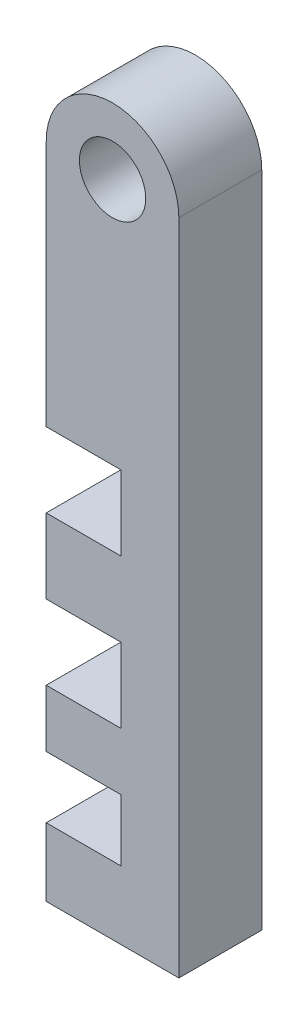
ISO-10303-21;
HEADER;
FILE_DESCRIPTION(('STEP AP214'),'2;1');
FILE_NAME('part.step','',(''),(''),'','','');
FILE_SCHEMA(('AUTOMOTIVE_DESIGN { 1 0 10303 214 1 1 1 1 }'));
ENDSEC;
DATA;
#1=APPLICATION_CONTEXT('core data for automotive mechanical design processes');
#2=APPLICATION_PROTOCOL_DEFINITION('international standard','automotive_design',2000,#1);
#3=PRODUCT_CONTEXT('',#1,'mechanical');
#4=PRODUCT('Part','Part','',(#3));
#5=PRODUCT_RELATED_PRODUCT_CATEGORY('part','',(#4));
#6=PRODUCT_DEFINITION_FORMATION('','',#4);
#7=PRODUCT_DEFINITION_CONTEXT('part definition',#1,'design');
#8=PRODUCT_DEFINITION('design','',#6,#7);
#9=PRODUCT_DEFINITION_SHAPE('','',#8);
#10=(LENGTH_UNIT() NAMED_UNIT(*) SI_UNIT(.MILLI.,.METRE.));
#11=(NAMED_UNIT(*) PLANE_ANGLE_UNIT() SI_UNIT($,.RADIAN.));
#12=(NAMED_UNIT(*) SI_UNIT($,.STERADIAN.) SOLID_ANGLE_UNIT());
#13=UNCERTAINTY_MEASURE_WITH_UNIT(LENGTH_MEASURE(1.E-05),#10,'distance_accuracy_value','');
#14=(GEOMETRIC_REPRESENTATION_CONTEXT(3) GLOBAL_UNCERTAINTY_ASSIGNED_CONTEXT((#13)) GLOBAL_UNIT_ASSIGNED_CONTEXT((#10,
#11,#12)) REPRESENTATION_CONTEXT('',''));
#15=CARTESIAN_POINT('',(0.,0.,0.));
#16=DIRECTION('',(0.,0.,1.));
#17=DIRECTION('',(1.,0.,0.));
#18=AXIS2_PLACEMENT_3D('',#15,#16,#17);
#19=CARTESIAN_POINT('',(-56.8186498005052,11.3062459124783,5.));
#20=DIRECTION('',(0.,0.,1.));
#21=DIRECTION('',(1.,0.,0.));
#22=AXIS2_PLACEMENT_3D('',#19,#20,#21);
#23=PLANE('',#22);
#24=CARTESIAN_POINT('',(-56.8186498005052,11.3062459124783,5.));
#25=DIRECTION('',(0.,0.,1.));
#26=DIRECTION('',(1.,0.,0.));
#27=AXIS2_PLACEMENT_3D('',#24,#25,#26);
#28=CIRCLE('',#27,4.00000000000001);
#29=CARTESIAN_POINT('',(-52.8186498005052,11.3062459124783,5.));
#30=VERTEX_POINT('',#29);
#31=CARTESIAN_POINT('',(-60.8186498005052,11.3062459124783,5.));
#32=VERTEX_POINT('',#31);
#33=EDGE_CURVE('E209',#30,#32,#28,.T.);
#34=ORIENTED_EDGE('',*,*,#33,.T.);
#35=DIRECTION('',(0.,-1.,0.));
#36=VECTOR('',#35,1.);
#37=CARTESIAN_POINT('',(-60.8186498005052,1.00460991247836,5.));
#38=LINE('',#37,#36);
#39=CARTESIAN_POINT('',(-60.8186498005052,-3.60922108752164,5.));
#40=VERTEX_POINT('',#39);
#41=EDGE_CURVE('E117',#32,#40,#38,.T.);
#42=ORIENTED_EDGE('',*,*,#41,.T.);
#43=DIRECTION('',(1.,0.,0.));
#44=VECTOR('',#43,1.);
#45=CARTESIAN_POINT('',(-56.3186498005052,-3.60922108752164,5.));
#46=LINE('',#45,#44);
#47=CARTESIAN_POINT('',(-56.3186498005052,-3.60922108752164,5.));
#48=VERTEX_POINT('',#47);
#49=EDGE_CURVE('E248',#40,#48,#46,.T.);
#50=ORIENTED_EDGE('',*,*,#49,.T.);
#51=DIRECTION('',(0.,-1.,0.));
#52=VECTOR('',#51,1.);
#53=CARTESIAN_POINT('',(-56.3186498005052,-8.10922108752164,5.));
#54=LINE('',#53,#52);
#55=CARTESIAN_POINT('',(-56.3186498005052,-8.10922108752164,5.));
#56=VERTEX_POINT('',#55);
#57=EDGE_CURVE('E267',#48,#56,#54,.T.);
#58=ORIENTED_EDGE('',*,*,#57,.T.);
#59=DIRECTION('',(-1.,0.,0.));
#60=VECTOR('',#59,1.);
#61=CARTESIAN_POINT('',(-60.8186498005052,-8.10922108752164,5.));
#62=LINE('',#61,#60);
#63=CARTESIAN_POINT('',(-60.8186498005052,-8.10922108752164,5.));
#64=VERTEX_POINT('',#63);
#65=EDGE_CURVE('E264',#56,#64,#62,.T.);
#66=ORIENTED_EDGE('',*,*,#65,.T.);
#67=DIRECTION('',(0.,-1.,0.));
#68=VECTOR('',#67,1.);
#69=CARTESIAN_POINT('',(-60.8186498005052,-12.6092210875216,5.));
#70=LINE('',#69,#68);
#71=CARTESIAN_POINT('',(-60.8186498005052,-12.6092210875216,5.));
#72=VERTEX_POINT('',#71);
#73=EDGE_CURVE('E266',#64,#72,#70,.T.);
#74=ORIENTED_EDGE('',*,*,#73,.T.);
#75=DIRECTION('',(1.,0.,0.));
#76=VECTOR('',#75,1.);
#77=CARTESIAN_POINT('',(-56.3186498005052,-12.6092210875216,5.));
#78=LINE('',#77,#76);
#79=CARTESIAN_POINT('',(-56.3186498005052,-12.6092210875216,5.));
#80=VERTEX_POINT('',#79);
#81=EDGE_CURVE('E269',#72,#80,#78,.T.);
#82=ORIENTED_EDGE('',*,*,#81,.T.);
#83=DIRECTION('',(0.,-1.,0.));
#84=VECTOR('',#83,1.);
#85=CARTESIAN_POINT('',(-56.3186498005052,-17.1092210875216,5.));
#86=LINE('',#85,#84);
#87=CARTESIAN_POINT('',(-56.3186498005052,-17.1092210875216,5.));
#88=VERTEX_POINT('',#87);
#89=EDGE_CURVE('E275',#80,#88,#86,.T.);
#90=ORIENTED_EDGE('',*,*,#89,.T.);
#91=DIRECTION('',(-1.,0.,0.));
#92=VECTOR('',#91,1.);
#93=CARTESIAN_POINT('',(-60.8186498005052,-17.1092210875216,5.));
#94=LINE('',#93,#92);
#95=CARTESIAN_POINT('',(-60.8186498005052,-17.1092210875216,5.));
#96=VERTEX_POINT('',#95);
#97=EDGE_CURVE('E277',#88,#96,#94,.T.);
#98=ORIENTED_EDGE('',*,*,#97,.T.);
#99=DIRECTION('',(0.,-1.,0.));
#100=VECTOR('',#99,1.);
#101=CARTESIAN_POINT('',(-60.8186498005052,-20.5733320875216,5.));
#102=LINE('',#101,#100);
#103=CARTESIAN_POINT('',(-60.8186498005052,-20.5733320875216,5.));
#104=VERTEX_POINT('',#103);
#105=EDGE_CURVE('E279',#96,#104,#102,.T.);
#106=ORIENTED_EDGE('',*,*,#105,.T.);
#107=DIRECTION('',(1.,0.,0.));
#108=VECTOR('',#107,1.);
#109=CARTESIAN_POINT('',(-56.3186498005052,-20.5733320875216,5.));
#110=LINE('',#109,#108);
#111=CARTESIAN_POINT('',(-56.3186498005052,-20.5733320875216,5.));
#112=VERTEX_POINT('',#111);
#113=EDGE_CURVE('E281',#104,#112,#110,.T.);
#114=ORIENTED_EDGE('',*,*,#113,.T.);
#115=DIRECTION('',(0.,-1.,0.));
#116=VECTOR('',#115,1.);
#117=CARTESIAN_POINT('',(-56.3186498005052,-20.5733320875216,5.));
#118=LINE('',#117,#116);
#119=CARTESIAN_POINT('',(-56.3186498005052,-24.2940960875216,5.));
#120=VERTEX_POINT('',#119);
#121=EDGE_CURVE('E283',#112,#120,#118,.T.);
#122=ORIENTED_EDGE('',*,*,#121,.T.);
#123=DIRECTION('',(-1.,0.,0.));
#124=VECTOR('',#123,1.);
#125=CARTESIAN_POINT('',(-60.8186498005052,-24.2940960875216,5.));
#126=LINE('',#125,#124);
#127=CARTESIAN_POINT('',(-60.8186498005052,-24.2940960875216,5.));
#128=VERTEX_POINT('',#127);
#129=EDGE_CURVE('E160',#120,#128,#126,.T.);
#130=ORIENTED_EDGE('',*,*,#129,.T.);
#131=DIRECTION('',(0.,-1.,0.));
#132=VECTOR('',#131,1.);
#133=CARTESIAN_POINT('',(-60.8186498005052,-28.4024330875216,5.));
#134=LINE('',#133,#132);
#135=CARTESIAN_POINT('',(-60.8186498005052,-28.4024330875216,5.));
#136=VERTEX_POINT('',#135);
#137=EDGE_CURVE('E154',#128,#136,#134,.T.);
#138=ORIENTED_EDGE('',*,*,#137,.T.);
#139=DIRECTION('',(1.,0.,0.));
#140=VECTOR('',#139,1.);
#141=CARTESIAN_POINT('',(-52.8186498005052,-28.4024330875216,5.));
#142=LINE('',#141,#140);
#143=CARTESIAN_POINT('',(-52.8186498005052,-28.4024330875216,5.));
#144=VERTEX_POINT('',#143);
#145=EDGE_CURVE('E158',#136,#144,#142,.T.);
#146=ORIENTED_EDGE('',*,*,#145,.T.);
#147=DIRECTION('',(0.,1.,0.));
#148=VECTOR('',#147,1.);
#149=CARTESIAN_POINT('',(-52.8186498005052,11.3062459124783,5.));
#150=LINE('',#149,#148);
#151=EDGE_CURVE('E50',#144,#30,#150,.T.);
#152=ORIENTED_EDGE('',*,*,#151,.T.);
#153=EDGE_LOOP('',(#34,#42,#50,#58,#66,#74,#82,#90,#98,#106,#114,#122,#130,#138,#146,#152));
#154=FACE_BOUND('',#153,.T.);
#155=CARTESIAN_POINT('',(-56.8186498005052,11.3062459124783,5.));
#156=DIRECTION('',(0.,0.,1.));
#157=DIRECTION('',(1.,0.,0.));
#158=AXIS2_PLACEMENT_3D('',#155,#156,#157);
#159=CIRCLE('',#158,2.);
#160=CARTESIAN_POINT('',(-54.8186498005052,11.3062459124783,5.));
#161=VERTEX_POINT('',#160);
#162=EDGE_CURVE('E182',#161,#161,#159,.T.);
#163=ORIENTED_EDGE('',*,*,#162,.F.);
#164=EDGE_LOOP('',(#163));
#165=FACE_BOUND('',#164,.T.);
#166=ADVANCED_FACE('F33',(#154,#165),#23,.T.);
#167=CARTESIAN_POINT('',(-56.8186498005052,11.3062459124783,0.));
#168=DIRECTION('',(0.,0.,1.));
#169=DIRECTION('',(1.,0.,0.));
#170=AXIS2_PLACEMENT_3D('',#167,#168,#169);
#171=PLANE('',#170);
#172=CARTESIAN_POINT('',(-56.8186498005052,11.3062459124783,0.));
#173=DIRECTION('',(0.,0.,1.));
#174=DIRECTION('',(1.,0.,0.));
#175=AXIS2_PLACEMENT_3D('',#172,#173,#174);
#176=CIRCLE('',#175,4.00000000000001);
#177=CARTESIAN_POINT('',(-52.8186498005052,11.3062459124783,0.));
#178=VERTEX_POINT('',#177);
#179=CARTESIAN_POINT('',(-60.8186498005052,11.3062459124783,0.));
#180=VERTEX_POINT('',#179);
#181=EDGE_CURVE('E178',#178,#180,#176,.T.);
#182=ORIENTED_EDGE('',*,*,#181,.F.);
#183=DIRECTION('',(0.,1.,0.));
#184=VECTOR('',#183,1.);
#185=CARTESIAN_POINT('',(-52.8186498005052,11.3062459124783,0.));
#186=LINE('',#185,#184);
#187=CARTESIAN_POINT('',(-52.8186498005052,-28.4024330875216,0.));
#188=VERTEX_POINT('',#187);
#189=EDGE_CURVE('E109',#188,#178,#186,.T.);
#190=ORIENTED_EDGE('',*,*,#189,.F.);
#191=DIRECTION('',(1.,0.,0.));
#192=VECTOR('',#191,1.);
#193=CARTESIAN_POINT('',(-52.8186498005052,-28.4024330875216,0.));
#194=LINE('',#193,#192);
#195=CARTESIAN_POINT('',(-60.8186498005052,-28.4024330875216,0.));
#196=VERTEX_POINT('',#195);
#197=EDGE_CURVE('E103',#196,#188,#194,.T.);
#198=ORIENTED_EDGE('',*,*,#197,.F.);
#199=DIRECTION('',(0.,-1.,0.));
#200=VECTOR('',#199,1.);
#201=CARTESIAN_POINT('',(-60.8186498005052,-28.4024330875216,0.));
#202=LINE('',#201,#200);
#203=CARTESIAN_POINT('',(-60.8186498005052,-24.2940960875216,0.));
#204=VERTEX_POINT('',#203);
#205=EDGE_CURVE('E168',#204,#196,#202,.T.);
#206=ORIENTED_EDGE('',*,*,#205,.F.);
#207=DIRECTION('',(-1.,0.,0.));
#208=VECTOR('',#207,1.);
#209=CARTESIAN_POINT('',(-60.8186498005052,-24.2940960875216,0.));
#210=LINE('',#209,#208);
#211=CARTESIAN_POINT('',(-56.3186498005052,-24.2940960875216,0.));
#212=VERTEX_POINT('',#211);
#213=EDGE_CURVE('E204',#212,#204,#210,.T.);
#214=ORIENTED_EDGE('',*,*,#213,.F.);
#215=DIRECTION('',(0.,-1.,0.));
#216=VECTOR('',#215,1.);
#217=CARTESIAN_POINT('',(-56.3186498005052,-20.5733320875216,0.));
#218=LINE('',#217,#216);
#219=CARTESIAN_POINT('',(-56.3186498005052,-20.5733320875216,0.));
#220=VERTEX_POINT('',#219);
#221=EDGE_CURVE('E202',#220,#212,#218,.T.);
#222=ORIENTED_EDGE('',*,*,#221,.F.);
#223=DIRECTION('',(1.,0.,0.));
#224=VECTOR('',#223,1.);
#225=CARTESIAN_POINT('',(-56.3186498005052,-20.5733320875216,0.));
#226=LINE('',#225,#224);
#227=CARTESIAN_POINT('',(-60.8186498005052,-20.5733320875216,0.));
#228=VERTEX_POINT('',#227);
#229=EDGE_CURVE('E200',#228,#220,#226,.T.);
#230=ORIENTED_EDGE('',*,*,#229,.F.);
#231=DIRECTION('',(0.,-1.,0.));
#232=VECTOR('',#231,1.);
#233=CARTESIAN_POINT('',(-60.8186498005052,-20.5733320875216,0.));
#234=LINE('',#233,#232);
#235=CARTESIAN_POINT('',(-60.8186498005052,-17.1092210875216,0.));
#236=VERTEX_POINT('',#235);
#237=EDGE_CURVE('E198',#236,#228,#234,.T.);
#238=ORIENTED_EDGE('',*,*,#237,.F.);
#239=DIRECTION('',(-1.,0.,0.));
#240=VECTOR('',#239,1.);
#241=CARTESIAN_POINT('',(-60.8186498005052,-17.1092210875216,0.));
#242=LINE('',#241,#240);
#243=CARTESIAN_POINT('',(-56.3186498005052,-17.1092210875216,0.));
#244=VERTEX_POINT('',#243);
#245=EDGE_CURVE('E196',#244,#236,#242,.T.);
#246=ORIENTED_EDGE('',*,*,#245,.F.);
#247=DIRECTION('',(0.,-1.,0.));
#248=VECTOR('',#247,1.);
#249=CARTESIAN_POINT('',(-56.3186498005052,-17.1092210875216,0.));
#250=LINE('',#249,#248);
#251=CARTESIAN_POINT('',(-56.3186498005052,-12.6092210875216,0.));
#252=VERTEX_POINT('',#251);
#253=EDGE_CURVE('E194',#252,#244,#250,.T.);
#254=ORIENTED_EDGE('',*,*,#253,.F.);
#255=DIRECTION('',(1.,0.,0.));
#256=VECTOR('',#255,1.);
#257=CARTESIAN_POINT('',(-56.3186498005052,-12.6092210875216,0.));
#258=LINE('',#257,#256);
#259=CARTESIAN_POINT('',(-60.8186498005052,-12.6092210875216,0.));
#260=VERTEX_POINT('',#259);
#261=EDGE_CURVE('E192',#260,#252,#258,.T.);
#262=ORIENTED_EDGE('',*,*,#261,.F.);
#263=DIRECTION('',(0.,-1.,0.));
#264=VECTOR('',#263,1.);
#265=CARTESIAN_POINT('',(-60.8186498005052,-12.6092210875216,0.));
#266=LINE('',#265,#264);
#267=CARTESIAN_POINT('',(-60.8186498005052,-8.10922108752164,0.));
#268=VERTEX_POINT('',#267);
#269=EDGE_CURVE('E190',#268,#260,#266,.T.);
#270=ORIENTED_EDGE('',*,*,#269,.F.);
#271=DIRECTION('',(-1.,0.,0.));
#272=VECTOR('',#271,1.);
#273=CARTESIAN_POINT('',(-60.8186498005052,-8.10922108752164,0.));
#274=LINE('',#273,#272);
#275=CARTESIAN_POINT('',(-56.3186498005052,-8.10922108752164,0.));
#276=VERTEX_POINT('',#275);
#277=EDGE_CURVE('E188',#276,#268,#274,.T.);
#278=ORIENTED_EDGE('',*,*,#277,.F.);
#279=DIRECTION('',(0.,-1.,0.));
#280=VECTOR('',#279,1.);
#281=CARTESIAN_POINT('',(-56.3186498005052,-8.10922108752164,0.));
#282=LINE('',#281,#280);
#283=CARTESIAN_POINT('',(-56.3186498005052,-3.60922108752164,0.));
#284=VERTEX_POINT('',#283);
#285=EDGE_CURVE('E186',#284,#276,#282,.T.);
#286=ORIENTED_EDGE('',*,*,#285,.F.);
#287=DIRECTION('',(1.,0.,0.));
#288=VECTOR('',#287,1.);
#289=CARTESIAN_POINT('',(-56.3186498005052,-3.60922108752164,0.));
#290=LINE('',#289,#288);
#291=CARTESIAN_POINT('',(-60.8186498005052,-3.60922108752164,0.));
#292=VERTEX_POINT('',#291);
#293=EDGE_CURVE('E184',#292,#284,#290,.T.);
#294=ORIENTED_EDGE('',*,*,#293,.F.);
#295=DIRECTION('',(0.,-1.,0.));
#296=VECTOR('',#295,1.);
#297=CARTESIAN_POINT('',(-60.8186498005052,-3.60922108752164,0.));
#298=LINE('',#297,#296);
#299=EDGE_CURVE('E181',#180,#292,#298,.T.);
#300=ORIENTED_EDGE('',*,*,#299,.F.);
#301=EDGE_LOOP('',(#182,#190,#198,#206,#214,#222,#230,#238,#246,#254,#262,#270,#278,#286,#294,#300));
#302=FACE_BOUND('',#301,.T.);
#303=CARTESIAN_POINT('',(-56.8186498005052,11.3062459124783,0.));
#304=DIRECTION('',(0.,0.,1.));
#305=DIRECTION('',(1.,0.,0.));
#306=AXIS2_PLACEMENT_3D('',#303,#304,#305);
#307=CIRCLE('',#306,2.);
#308=CARTESIAN_POINT('',(-54.8186498005052,11.3062459124783,0.));
#309=VERTEX_POINT('',#308);
#310=EDGE_CURVE('E485',#309,#309,#307,.T.);
#311=ORIENTED_EDGE('',*,*,#310,.T.);
#312=EDGE_LOOP('',(#311));
#313=FACE_BOUND('',#312,.T.);
#314=ADVANCED_FACE('F252',(#302,#313),#171,.F.);
#315=CARTESIAN_POINT('',(-56.8186498005052,11.3062459124783,5.));
#316=DIRECTION('',(0.,0.,-1.));
#317=DIRECTION('',(-1.,0.,0.));
#318=AXIS2_PLACEMENT_3D('',#315,#316,#317);
#319=CYLINDRICAL_SURFACE('',#318,4.00000000000001);
#320=ORIENTED_EDGE('',*,*,#181,.T.);
#321=DIRECTION('',(0.,0.,-1.));
#322=VECTOR('',#321,1.);
#323=CARTESIAN_POINT('',(-60.8186498005052,11.3062459124783,5.));
#324=LINE('',#323,#322);
#325=EDGE_CURVE('E11',#32,#180,#324,.T.);
#326=ORIENTED_EDGE('',*,*,#325,.F.);
#327=ORIENTED_EDGE('',*,*,#33,.F.);
#328=DIRECTION('',(0.,0.,-1.));
#329=VECTOR('',#328,1.);
#330=CARTESIAN_POINT('',(-52.8186498005052,11.3062459124783,5.));
#331=LINE('',#330,#329);
#332=EDGE_CURVE('E174',#30,#178,#331,.T.);
#333=ORIENTED_EDGE('',*,*,#332,.T.);
#334=EDGE_LOOP('',(#320,#326,#327,#333));
#335=FACE_BOUND('',#334,.T.);
#336=ADVANCED_FACE('F35',(#335),#319,.T.);
#337=CARTESIAN_POINT('',(-60.8186498005052,-3.60922108752164,5.));
#338=DIRECTION('',(1.,0.,0.));
#339=DIRECTION('',(0.,0.,-1.));
#340=AXIS2_PLACEMENT_3D('',#337,#338,#339);
#341=PLANE('',#340);
#342=ORIENTED_EDGE('',*,*,#299,.T.);
#343=DIRECTION('',(0.,0.,-1.));
#344=VECTOR('',#343,1.);
#345=CARTESIAN_POINT('',(-60.8186498005052,-3.60922108752164,5.));
#346=LINE('',#345,#344);
#347=EDGE_CURVE('E42',#40,#292,#346,.T.);
#348=ORIENTED_EDGE('',*,*,#347,.F.);
#349=ORIENTED_EDGE('',*,*,#41,.F.);
#350=ORIENTED_EDGE('',*,*,#325,.T.);
#351=EDGE_LOOP('',(#342,#348,#349,#350));
#352=FACE_BOUND('',#351,.T.);
#353=ADVANCED_FACE('F317',(#352),#341,.F.);
#354=CARTESIAN_POINT('',(-56.3186498005052,-3.60922108752164,5.));
#355=DIRECTION('',(0.,1.,0.));
#356=DIRECTION('',(0.,0.,1.));
#357=AXIS2_PLACEMENT_3D('',#354,#355,#356);
#358=PLANE('',#357);
#359=ORIENTED_EDGE('',*,*,#293,.T.);
#360=DIRECTION('',(0.,0.,-1.));
#361=VECTOR('',#360,1.);
#362=CARTESIAN_POINT('',(-56.3186498005052,-3.60922108752164,5.));
#363=LINE('',#362,#361);
#364=EDGE_CURVE('E240',#48,#284,#363,.T.);
#365=ORIENTED_EDGE('',*,*,#364,.F.);
#366=ORIENTED_EDGE('',*,*,#49,.F.);
#367=ORIENTED_EDGE('',*,*,#347,.T.);
#368=EDGE_LOOP('',(#359,#365,#366,#367));
#369=FACE_BOUND('',#368,.T.);
#370=ADVANCED_FACE('F246',(#369),#358,.F.);
#371=CARTESIAN_POINT('',(-56.3186498005052,-8.10922108752164,5.));
#372=DIRECTION('',(1.,0.,0.));
#373=DIRECTION('',(0.,0.,-1.));
#374=AXIS2_PLACEMENT_3D('',#371,#372,#373);
#375=PLANE('',#374);
#376=ORIENTED_EDGE('',*,*,#285,.T.);
#377=DIRECTION('',(0.,0.,-1.));
#378=VECTOR('',#377,1.);
#379=CARTESIAN_POINT('',(-56.3186498005052,-8.10922108752164,5.));
#380=LINE('',#379,#378);
#381=EDGE_CURVE('E237',#56,#276,#380,.T.);
#382=ORIENTED_EDGE('',*,*,#381,.F.);
#383=ORIENTED_EDGE('',*,*,#57,.F.);
#384=ORIENTED_EDGE('',*,*,#364,.T.);
#385=EDGE_LOOP('',(#376,#382,#383,#384));
#386=FACE_BOUND('',#385,.T.);
#387=ADVANCED_FACE('F258',(#386),#375,.F.);
#388=CARTESIAN_POINT('',(-60.8186498005052,-8.10922108752164,5.));
#389=DIRECTION('',(0.,-1.,0.));
#390=DIRECTION('',(0.,0.,-1.));
#391=AXIS2_PLACEMENT_3D('',#388,#389,#390);
#392=PLANE('',#391);
#393=ORIENTED_EDGE('',*,*,#277,.T.);
#394=DIRECTION('',(0.,0.,-1.));
#395=VECTOR('',#394,1.);
#396=CARTESIAN_POINT('',(-60.8186498005052,-8.10922108752164,5.));
#397=LINE('',#396,#395);
#398=EDGE_CURVE('E234',#64,#268,#397,.T.);
#399=ORIENTED_EDGE('',*,*,#398,.F.);
#400=ORIENTED_EDGE('',*,*,#65,.F.);
#401=ORIENTED_EDGE('',*,*,#381,.T.);
#402=EDGE_LOOP('',(#393,#399,#400,#401));
#403=FACE_BOUND('',#402,.T.);
#404=ADVANCED_FACE('F262',(#403),#392,.F.);
#405=CARTESIAN_POINT('',(-60.8186498005052,-12.6092210875216,5.));
#406=DIRECTION('',(1.,0.,0.));
#407=DIRECTION('',(0.,0.,-1.));
#408=AXIS2_PLACEMENT_3D('',#405,#406,#407);
#409=PLANE('',#408);
#410=ORIENTED_EDGE('',*,*,#269,.T.);
#411=DIRECTION('',(0.,0.,-1.));
#412=VECTOR('',#411,1.);
#413=CARTESIAN_POINT('',(-60.8186498005052,-12.6092210875216,5.));
#414=LINE('',#413,#412);
#415=EDGE_CURVE('E231',#72,#260,#414,.T.);
#416=ORIENTED_EDGE('',*,*,#415,.F.);
#417=ORIENTED_EDGE('',*,*,#73,.F.);
#418=ORIENTED_EDGE('',*,*,#398,.T.);
#419=EDGE_LOOP('',(#410,#416,#417,#418));
#420=FACE_BOUND('',#419,.T.);
#421=ADVANCED_FACE('F330',(#420),#409,.F.);
#422=CARTESIAN_POINT('',(-56.3186498005052,-12.6092210875216,5.));
#423=DIRECTION('',(0.,1.,0.));
#424=DIRECTION('',(0.,0.,1.));
#425=AXIS2_PLACEMENT_3D('',#422,#423,#424);
#426=PLANE('',#425);
#427=ORIENTED_EDGE('',*,*,#261,.T.);
#428=DIRECTION('',(0.,0.,-1.));
#429=VECTOR('',#428,1.);
#430=CARTESIAN_POINT('',(-56.3186498005052,-12.6092210875216,5.));
#431=LINE('',#430,#429);
#432=EDGE_CURVE('E228',#80,#252,#431,.T.);
#433=ORIENTED_EDGE('',*,*,#432,.F.);
#434=ORIENTED_EDGE('',*,*,#81,.F.);
#435=ORIENTED_EDGE('',*,*,#415,.T.);
#436=EDGE_LOOP('',(#427,#433,#434,#435));
#437=FACE_BOUND('',#436,.T.);
#438=ADVANCED_FACE('F333',(#437),#426,.F.);
#439=CARTESIAN_POINT('',(-56.3186498005052,-17.1092210875216,5.));
#440=DIRECTION('',(1.,0.,0.));
#441=DIRECTION('',(0.,0.,-1.));
#442=AXIS2_PLACEMENT_3D('',#439,#440,#441);
#443=PLANE('',#442);
#444=ORIENTED_EDGE('',*,*,#253,.T.);
#445=DIRECTION('',(0.,0.,-1.));
#446=VECTOR('',#445,1.);
#447=CARTESIAN_POINT('',(-56.3186498005052,-17.1092210875216,5.));
#448=LINE('',#447,#446);
#449=EDGE_CURVE('E225',#88,#244,#448,.T.);
#450=ORIENTED_EDGE('',*,*,#449,.F.);
#451=ORIENTED_EDGE('',*,*,#89,.F.);
#452=ORIENTED_EDGE('',*,*,#432,.T.);
#453=EDGE_LOOP('',(#444,#450,#451,#452));
#454=FACE_BOUND('',#453,.T.);
#455=ADVANCED_FACE('F337',(#454),#443,.F.);
#456=CARTESIAN_POINT('',(-60.8186498005052,-17.1092210875216,5.));
#457=DIRECTION('',(0.,-1.,0.));
#458=DIRECTION('',(0.,0.,-1.));
#459=AXIS2_PLACEMENT_3D('',#456,#457,#458);
#460=PLANE('',#459);
#461=ORIENTED_EDGE('',*,*,#245,.T.);
#462=DIRECTION('',(0.,0.,-1.));
#463=VECTOR('',#462,1.);
#464=CARTESIAN_POINT('',(-60.8186498005052,-17.1092210875216,5.));
#465=LINE('',#464,#463);
#466=EDGE_CURVE('E222',#96,#236,#465,.T.);
#467=ORIENTED_EDGE('',*,*,#466,.F.);
#468=ORIENTED_EDGE('',*,*,#97,.F.);
#469=ORIENTED_EDGE('',*,*,#449,.T.);
#470=EDGE_LOOP('',(#461,#467,#468,#469));
#471=FACE_BOUND('',#470,.T.);
#472=ADVANCED_FACE('F341',(#471),#460,.F.);
#473=CARTESIAN_POINT('',(-60.8186498005052,-20.5733320875216,5.));
#474=DIRECTION('',(1.,0.,0.));
#475=DIRECTION('',(0.,0.,-1.));
#476=AXIS2_PLACEMENT_3D('',#473,#474,#475);
#477=PLANE('',#476);
#478=ORIENTED_EDGE('',*,*,#237,.T.);
#479=DIRECTION('',(0.,0.,-1.));
#480=VECTOR('',#479,1.);
#481=CARTESIAN_POINT('',(-60.8186498005052,-20.5733320875216,5.));
#482=LINE('',#481,#480);
#483=EDGE_CURVE('E219',#104,#228,#482,.T.);
#484=ORIENTED_EDGE('',*,*,#483,.F.);
#485=ORIENTED_EDGE('',*,*,#105,.F.);
#486=ORIENTED_EDGE('',*,*,#466,.T.);
#487=EDGE_LOOP('',(#478,#484,#485,#486));
#488=FACE_BOUND('',#487,.T.);
#489=ADVANCED_FACE('F345',(#488),#477,.F.);
#490=CARTESIAN_POINT('',(-56.3186498005052,-20.5733320875216,5.));
#491=DIRECTION('',(0.,1.,0.));
#492=DIRECTION('',(0.,0.,1.));
#493=AXIS2_PLACEMENT_3D('',#490,#491,#492);
#494=PLANE('',#493);
#495=ORIENTED_EDGE('',*,*,#229,.T.);
#496=DIRECTION('',(0.,0.,-1.));
#497=VECTOR('',#496,1.);
#498=CARTESIAN_POINT('',(-56.3186498005052,-20.5733320875216,5.));
#499=LINE('',#498,#497);
#500=EDGE_CURVE('E216',#112,#220,#499,.T.);
#501=ORIENTED_EDGE('',*,*,#500,.F.);
#502=ORIENTED_EDGE('',*,*,#113,.F.);
#503=ORIENTED_EDGE('',*,*,#483,.T.);
#504=EDGE_LOOP('',(#495,#501,#502,#503));
#505=FACE_BOUND('',#504,.T.);
#506=ADVANCED_FACE('F349',(#505),#494,.F.);
#507=CARTESIAN_POINT('',(-56.3186498005052,-20.5733320875216,5.));
#508=DIRECTION('',(1.,0.,0.));
#509=DIRECTION('',(0.,0.,-1.));
#510=AXIS2_PLACEMENT_3D('',#507,#508,#509);
#511=PLANE('',#510);
#512=ORIENTED_EDGE('',*,*,#221,.T.);
#513=DIRECTION('',(0.,0.,-1.));
#514=VECTOR('',#513,1.);
#515=CARTESIAN_POINT('',(-56.3186498005052,-24.2940960875216,5.));
#516=LINE('',#515,#514);
#517=EDGE_CURVE('E213',#120,#212,#516,.T.);
#518=ORIENTED_EDGE('',*,*,#517,.F.);
#519=ORIENTED_EDGE('',*,*,#121,.F.);
#520=ORIENTED_EDGE('',*,*,#500,.T.);
#521=EDGE_LOOP('',(#512,#518,#519,#520));
#522=FACE_BOUND('',#521,.T.);
#523=ADVANCED_FACE('F289',(#522),#511,.F.);
#524=CARTESIAN_POINT('',(-60.8186498005052,-24.2940960875216,5.));
#525=DIRECTION('',(0.,-1.,0.));
#526=DIRECTION('',(0.,0.,-1.));
#527=AXIS2_PLACEMENT_3D('',#524,#525,#526);
#528=PLANE('',#527);
#529=ORIENTED_EDGE('',*,*,#213,.T.);
#530=DIRECTION('',(0.,0.,-1.));
#531=VECTOR('',#530,1.);
#532=CARTESIAN_POINT('',(-60.8186498005052,-24.2940960875216,5.));
#533=LINE('',#532,#531);
#534=EDGE_CURVE('E169',#128,#204,#533,.T.);
#535=ORIENTED_EDGE('',*,*,#534,.F.);
#536=ORIENTED_EDGE('',*,*,#129,.F.);
#537=ORIENTED_EDGE('',*,*,#517,.T.);
#538=EDGE_LOOP('',(#529,#535,#536,#537));
#539=FACE_BOUND('',#538,.T.);
#540=ADVANCED_FACE('F293',(#539),#528,.F.);
#541=CARTESIAN_POINT('',(-60.8186498005052,-28.4024330875216,5.));
#542=DIRECTION('',(1.,0.,0.));
#543=DIRECTION('',(0.,0.,-1.));
#544=AXIS2_PLACEMENT_3D('',#541,#542,#543);
#545=PLANE('',#544);
#546=ORIENTED_EDGE('',*,*,#205,.T.);
#547=DIRECTION('',(0.,0.,-1.));
#548=VECTOR('',#547,1.);
#549=CARTESIAN_POINT('',(-60.8186498005052,-28.4024330875216,5.));
#550=LINE('',#549,#548);
#551=EDGE_CURVE('E165',#136,#196,#550,.T.);
#552=ORIENTED_EDGE('',*,*,#551,.F.);
#553=ORIENTED_EDGE('',*,*,#137,.F.);
#554=ORIENTED_EDGE('',*,*,#534,.T.);
#555=EDGE_LOOP('',(#546,#552,#553,#554));
#556=FACE_BOUND('',#555,.T.);
#557=ADVANCED_FACE('F166',(#556),#545,.F.);
#558=CARTESIAN_POINT('',(-52.8186498005052,-28.4024330875216,5.));
#559=DIRECTION('',(0.,1.,0.));
#560=DIRECTION('',(0.,0.,1.));
#561=AXIS2_PLACEMENT_3D('',#558,#559,#560);
#562=PLANE('',#561);
#563=ORIENTED_EDGE('',*,*,#197,.T.);
#564=DIRECTION('',(0.,0.,-1.));
#565=VECTOR('',#564,1.);
#566=CARTESIAN_POINT('',(-52.8186498005052,-28.4024330875216,5.));
#567=LINE('',#566,#565);
#568=EDGE_CURVE('E170',#144,#188,#567,.T.);
#569=ORIENTED_EDGE('',*,*,#568,.F.);
#570=ORIENTED_EDGE('',*,*,#145,.F.);
#571=ORIENTED_EDGE('',*,*,#551,.T.);
#572=EDGE_LOOP('',(#563,#569,#570,#571));
#573=FACE_BOUND('',#572,.T.);
#574=ADVANCED_FACE('F172',(#573),#562,.F.);
#575=CARTESIAN_POINT('',(-52.8186498005052,11.3062459124783,5.));
#576=DIRECTION('',(-1.,0.,0.));
#577=DIRECTION('',(0.,0.,1.));
#578=AXIS2_PLACEMENT_3D('',#575,#576,#577);
#579=PLANE('',#578);
#580=ORIENTED_EDGE('',*,*,#189,.T.);
#581=ORIENTED_EDGE('',*,*,#332,.F.);
#582=ORIENTED_EDGE('',*,*,#151,.F.);
#583=ORIENTED_EDGE('',*,*,#568,.T.);
#584=EDGE_LOOP('',(#580,#581,#582,#583));
#585=FACE_BOUND('',#584,.T.);
#586=ADVANCED_FACE('F297',(#585),#579,.F.);
#587=CARTESIAN_POINT('',(-56.8186498005052,11.3062459124783,5.));
#588=DIRECTION('',(0.,0.,-1.));
#589=DIRECTION('',(-1.,0.,0.));
#590=AXIS2_PLACEMENT_3D('',#587,#588,#589);
#591=CYLINDRICAL_SURFACE('',#590,2.);
#592=ORIENTED_EDGE('',*,*,#162,.T.);
#593=EDGE_LOOP('',(#592));
#594=FACE_BOUND('',#593,.T.);
#595=ORIENTED_EDGE('',*,*,#310,.F.);
#596=EDGE_LOOP('',(#595));
#597=FACE_BOUND('',#596,.T.);
#598=ADVANCED_FACE('F299',(#594,#597),#591,.F.);
#599=CLOSED_SHELL('',(#166,#314,#336,#353,#370,#387,#404,#421,#438,#455,#472,#489,#506,#523,
#540,#557,#574,#586,#598));
#600=MANIFOLD_SOLID_BREP('B2',#599);
#601=ADVANCED_BREP_SHAPE_REPRESENTATION('',(#18,#600),#14);
#602=SHAPE_DEFINITION_REPRESENTATION(#9,#601);
ENDSEC;
END-ISO-10303-21;
